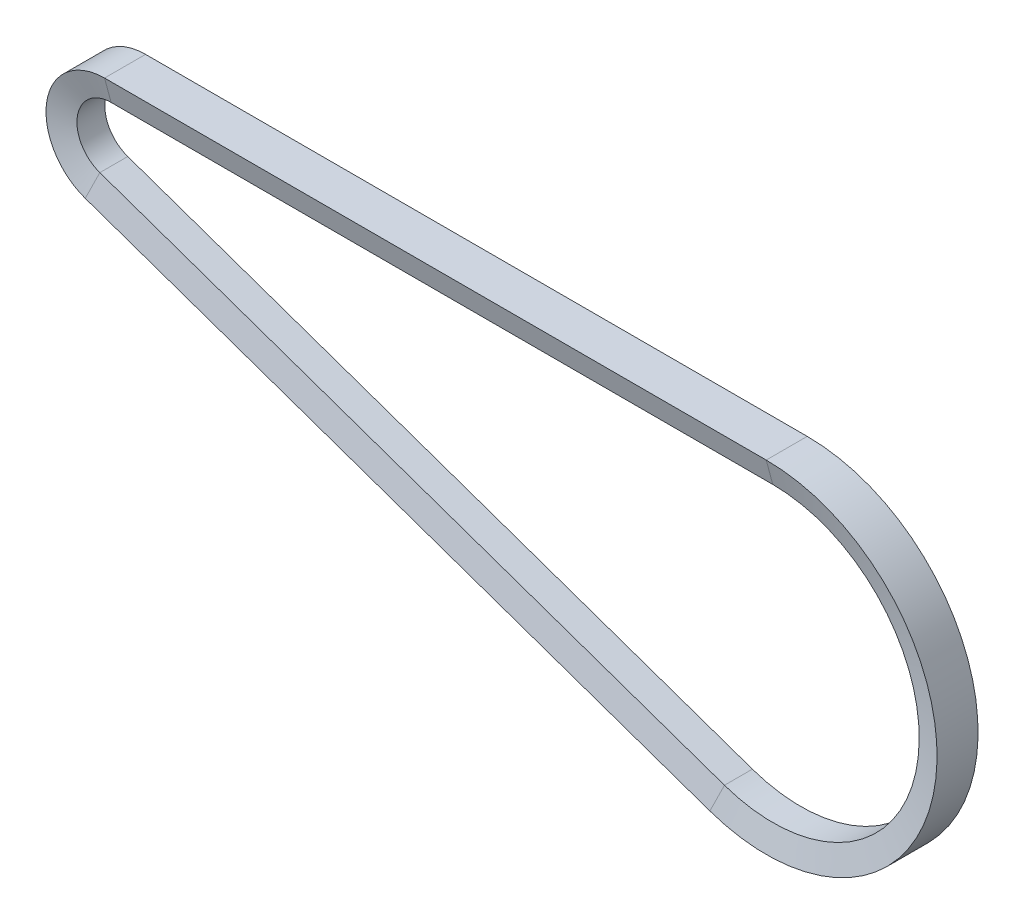
ISO-10303-21;
HEADER;
FILE_DESCRIPTION(('STEP AP214'),'2;1');
FILE_NAME('part.step','',(''),(''),'','','');
FILE_SCHEMA(('AUTOMOTIVE_DESIGN { 1 0 10303 214 1 1 1 1 }'));
ENDSEC;
DATA;
#1=APPLICATION_CONTEXT('core data for automotive mechanical design processes');
#2=APPLICATION_PROTOCOL_DEFINITION('international standard','automotive_design',2000,#1);
#3=PRODUCT_CONTEXT('',#1,'mechanical');
#4=PRODUCT('Part','Part','',(#3));
#5=PRODUCT_RELATED_PRODUCT_CATEGORY('part','',(#4));
#6=PRODUCT_DEFINITION_FORMATION('','',#4);
#7=PRODUCT_DEFINITION_CONTEXT('part definition',#1,'design');
#8=PRODUCT_DEFINITION('design','',#6,#7);
#9=PRODUCT_DEFINITION_SHAPE('','',#8);
#10=(LENGTH_UNIT() NAMED_UNIT(*) SI_UNIT(.MILLI.,.METRE.));
#11=(NAMED_UNIT(*) PLANE_ANGLE_UNIT() SI_UNIT($,.RADIAN.));
#12=(NAMED_UNIT(*) SI_UNIT($,.STERADIAN.) SOLID_ANGLE_UNIT());
#13=UNCERTAINTY_MEASURE_WITH_UNIT(LENGTH_MEASURE(1.E-05),#10,'distance_accuracy_value','');
#14=(GEOMETRIC_REPRESENTATION_CONTEXT(3) GLOBAL_UNCERTAINTY_ASSIGNED_CONTEXT((#13)) GLOBAL_UNIT_ASSIGNED_CONTEXT((#10,
#11,#12)) REPRESENTATION_CONTEXT('',''));
#15=CARTESIAN_POINT('',(0.,0.,0.));
#16=DIRECTION('',(0.,0.,1.));
#17=DIRECTION('',(1.,0.,0.));
#18=AXIS2_PLACEMENT_3D('',#15,#16,#17);
#19=CARTESIAN_POINT('',(0.,10.,-8.4));
#20=DIRECTION('',(0.,0.258819045102518,0.965925826289069));
#21=DIRECTION('',(0.,-0.965925826289069,0.258819045102518));
#22=AXIS2_PLACEMENT_3D('',#19,#20,#21);
#23=PLANE('',#22);
#24=DIRECTION('',(-1.,0.,0.));
#25=VECTOR('',#24,1.);
#26=CARTESIAN_POINT('',(0.,10.,-8.4));
#27=LINE('',#26,#25);
#28=CARTESIAN_POINT('',(138.062716113244,9.99999999999999,-8.4));
#29=VERTEX_POINT('',#28);
#30=CARTESIAN_POINT('',(-133.062716113244,10.,-8.4));
#31=VERTEX_POINT('',#30);
#32=EDGE_CURVE('E158',#29,#31,#27,.T.);
#33=ORIENTED_EDGE('',*,*,#32,.F.);
#34=DIRECTION('',(0.,0.965925826289069,-0.258819045102518));
#35=VECTOR('',#34,1.);
#36=CARTESIAN_POINT('',(138.062716113244,10.,-8.4));
#37=LINE('',#36,#35);
#38=CARTESIAN_POINT('',(138.062716113244,0.,-5.72050807568881));
#39=VERTEX_POINT('',#38);
#40=EDGE_CURVE('E161',#39,#29,#37,.T.);
#41=ORIENTED_EDGE('',*,*,#40,.F.);
#42=DIRECTION('',(-1.,0.,0.));
#43=VECTOR('',#42,1.);
#44=CARTESIAN_POINT('',(0.,0.,-5.72050807568881));
#45=LINE('',#44,#43);
#46=CARTESIAN_POINT('',(-133.062716113244,0.,-5.72050807568881));
#47=VERTEX_POINT('',#46);
#48=EDGE_CURVE('E149',#39,#47,#45,.T.);
#49=ORIENTED_EDGE('',*,*,#48,.T.);
#50=DIRECTION('',(0.,0.965925826289069,-0.258819045102518));
#51=VECTOR('',#50,1.);
#52=CARTESIAN_POINT('',(-133.062716113244,10.,-8.4));
#53=LINE('',#52,#51);
#54=EDGE_CURVE('E152',#47,#31,#53,.T.);
#55=ORIENTED_EDGE('',*,*,#54,.T.);
#56=EDGE_LOOP('',(#33,#41,#49,#55));
#57=FACE_BOUND('',#56,.T.);
#58=ADVANCED_FACE('F39',(#57),#23,.F.);
#59=CARTESIAN_POINT('',(0.,10.,8.4));
#60=DIRECTION('',(0.,-1.,0.));
#61=DIRECTION('',(0.,0.,-1.));
#62=AXIS2_PLACEMENT_3D('',#59,#60,#61);
#63=PLANE('',#62);
#64=DIRECTION('',(-1.,0.,0.));
#65=VECTOR('',#64,1.);
#66=CARTESIAN_POINT('',(0.,10.,8.4));
#67=LINE('',#66,#65);
#68=CARTESIAN_POINT('',(138.062716113244,9.99999999999999,8.4));
#69=VERTEX_POINT('',#68);
#70=CARTESIAN_POINT('',(-133.062716113244,10.,8.4));
#71=VERTEX_POINT('',#70);
#72=EDGE_CURVE('E63',#69,#71,#67,.T.);
#73=ORIENTED_EDGE('',*,*,#72,.F.);
#74=DIRECTION('',(0.,0.,1.));
#75=VECTOR('',#74,1.);
#76=CARTESIAN_POINT('',(138.062716113244,10.,8.4));
#77=LINE('',#76,#75);
#78=EDGE_CURVE('E179',#29,#69,#77,.T.);
#79=ORIENTED_EDGE('',*,*,#78,.F.);
#80=ORIENTED_EDGE('',*,*,#32,.T.);
#81=DIRECTION('',(0.,0.,1.));
#82=VECTOR('',#81,1.);
#83=CARTESIAN_POINT('',(-133.062716113244,10.,8.4));
#84=LINE('',#83,#82);
#85=EDGE_CURVE('E182',#31,#71,#84,.T.);
#86=ORIENTED_EDGE('',*,*,#85,.T.);
#87=EDGE_LOOP('',(#73,#79,#80,#86));
#88=FACE_BOUND('',#87,.T.);
#89=ADVANCED_FACE('F241',(#88),#63,.F.);
#90=CARTESIAN_POINT('',(0.,0.,5.72050807568881));
#91=DIRECTION('',(0.,0.258819045102518,-0.965925826289069));
#92=DIRECTION('',(0.,0.965925826289069,0.258819045102518));
#93=AXIS2_PLACEMENT_3D('',#90,#91,#92);
#94=PLANE('',#93);
#95=DIRECTION('',(-1.,0.,0.));
#96=VECTOR('',#95,1.);
#97=CARTESIAN_POINT('',(0.,0.,5.72050807568881));
#98=LINE('',#97,#96);
#99=CARTESIAN_POINT('',(138.062716113244,0.,5.72050807568881));
#100=VERTEX_POINT('',#99);
#101=CARTESIAN_POINT('',(-133.062716113244,0.,5.72050807568881));
#102=VERTEX_POINT('',#101);
#103=EDGE_CURVE('E54',#100,#102,#98,.T.);
#104=ORIENTED_EDGE('',*,*,#103,.F.);
#105=DIRECTION('',(0.,-0.965925826289069,-0.258819045102518));
#106=VECTOR('',#105,1.);
#107=CARTESIAN_POINT('',(138.062716113244,0.,5.72050807568881));
#108=LINE('',#107,#106);
#109=EDGE_CURVE('E197',#69,#100,#108,.T.);
#110=ORIENTED_EDGE('',*,*,#109,.F.);
#111=ORIENTED_EDGE('',*,*,#72,.T.);
#112=DIRECTION('',(0.,-0.965925826289069,-0.258819045102518));
#113=VECTOR('',#112,1.);
#114=CARTESIAN_POINT('',(-133.062716113244,0.,5.72050807568881));
#115=LINE('',#114,#113);
#116=EDGE_CURVE('E185',#71,#102,#115,.T.);
#117=ORIENTED_EDGE('',*,*,#116,.T.);
#118=EDGE_LOOP('',(#104,#110,#111,#117));
#119=FACE_BOUND('',#118,.T.);
#120=ADVANCED_FACE('F238',(#119),#94,.F.);
#121=CARTESIAN_POINT('',(0.,0.,-5.72050807568881));
#122=DIRECTION('',(0.,1.,0.));
#123=DIRECTION('',(0.,0.,1.));
#124=AXIS2_PLACEMENT_3D('',#121,#122,#123);
#125=PLANE('',#124);
#126=DIRECTION('',(0.,0.,-1.));
#127=VECTOR('',#126,1.);
#128=CARTESIAN_POINT('',(-133.062716113244,0.,-5.72050807568881));
#129=LINE('',#128,#127);
#130=EDGE_CURVE('E138',#102,#47,#129,.T.);
#131=ORIENTED_EDGE('',*,*,#130,.T.);
#132=ORIENTED_EDGE('',*,*,#48,.F.);
#133=DIRECTION('',(0.,0.,-1.));
#134=VECTOR('',#133,1.);
#135=CARTESIAN_POINT('',(138.062716113244,0.,-5.72050807568881));
#136=LINE('',#135,#134);
#137=EDGE_CURVE('E11',#100,#39,#136,.T.);
#138=ORIENTED_EDGE('',*,*,#137,.F.);
#139=ORIENTED_EDGE('',*,*,#103,.T.);
#140=EDGE_LOOP('',(#131,#132,#138,#139));
#141=FACE_BOUND('',#140,.T.);
#142=ADVANCED_FACE('F147',(#141),#125,.F.);
#143=CARTESIAN_POINT('',(-133.062716113244,-14.,-5.72050807568881));
#144=DIRECTION('',(0.,0.,-1.));
#145=DIRECTION('',(-1.,0.,0.));
#146=AXIS2_PLACEMENT_3D('',#143,#144,#145);
#147=CONICAL_SURFACE('',#146,14.,1.30899693899575);
#148=CARTESIAN_POINT('',(-133.062716113244,-14.,-8.4));
#149=DIRECTION('',(0.,0.,1.));
#150=DIRECTION('',(0.,1.,0.));
#151=AXIS2_PLACEMENT_3D('',#148,#149,#150);
#152=CIRCLE('',#151,24.);
#153=CARTESIAN_POINT('',(-140.978682451837,-36.6569520661157,-8.4));
#154=VERTEX_POINT('',#153);
#155=EDGE_CURVE('E155',#31,#154,#152,.T.);
#156=ORIENTED_EDGE('',*,*,#155,.F.);
#157=ORIENTED_EDGE('',*,*,#54,.F.);
#158=CARTESIAN_POINT('',(-133.062716113244,-14.,-5.72050807568881));
#159=DIRECTION('',(0.,0.,1.));
#160=DIRECTION('',(0.,1.,0.));
#161=AXIS2_PLACEMENT_3D('',#158,#159,#160);
#162=CIRCLE('',#161,14.);
#163=CARTESIAN_POINT('',(-137.68036314409,-27.2165553719008,-5.72050807568881));
#164=VERTEX_POINT('',#163);
#165=EDGE_CURVE('E134',#47,#164,#162,.T.);
#166=ORIENTED_EDGE('',*,*,#165,.T.);
#167=DIRECTION('',(-0.318593180270075,-0.91187229773561,-0.258819045102518));
#168=VECTOR('',#167,1.);
#169=CARTESIAN_POINT('',(-140.978682451837,-36.6569520661157,-8.4));
#170=LINE('',#169,#168);
#171=EDGE_CURVE('E144',#164,#154,#170,.T.);
#172=ORIENTED_EDGE('',*,*,#171,.T.);
#173=EDGE_LOOP('',(#156,#157,#166,#172));
#174=FACE_BOUND('',#173,.T.);
#175=ADVANCED_FACE('F153',(#174),#147,.F.);
#176=CARTESIAN_POINT('',(-133.062716113244,-14.,0.));
#177=DIRECTION('',(0.,0.,1.));
#178=DIRECTION('',(1.,0.,0.));
#179=AXIS2_PLACEMENT_3D('',#176,#177,#178);
#180=CYLINDRICAL_SURFACE('',#179,24.);
#181=CARTESIAN_POINT('',(-133.062716113244,-14.,8.4));
#182=DIRECTION('',(0.,0.,1.));
#183=DIRECTION('',(0.,1.,0.));
#184=AXIS2_PLACEMENT_3D('',#181,#182,#183);
#185=CIRCLE('',#184,24.);
#186=CARTESIAN_POINT('',(-140.978682451837,-36.6569520661157,8.4));
#187=VERTEX_POINT('',#186);
#188=EDGE_CURVE('E188',#71,#187,#185,.T.);
#189=ORIENTED_EDGE('',*,*,#188,.F.);
#190=ORIENTED_EDGE('',*,*,#85,.F.);
#191=ORIENTED_EDGE('',*,*,#155,.T.);
#192=DIRECTION('',(0.,0.,1.));
#193=VECTOR('',#192,1.);
#194=CARTESIAN_POINT('',(-140.978682451837,-36.6569520661157,8.4));
#195=LINE('',#194,#193);
#196=EDGE_CURVE('E167',#154,#187,#195,.T.);
#197=ORIENTED_EDGE('',*,*,#196,.T.);
#198=EDGE_LOOP('',(#189,#190,#191,#197));
#199=FACE_BOUND('',#198,.T.);
#200=ADVANCED_FACE('F243',(#199),#180,.T.);
#201=CARTESIAN_POINT('',(-133.062716113244,-14.,8.4));
#202=DIRECTION('',(0.,0.,1.));
#203=DIRECTION('',(1.,0.,0.));
#204=AXIS2_PLACEMENT_3D('',#201,#202,#203);
#205=CONICAL_SURFACE('',#204,24.,1.30899693899575);
#206=CARTESIAN_POINT('',(-133.062716113244,-14.,5.72050807568881));
#207=DIRECTION('',(0.,0.,1.));
#208=DIRECTION('',(0.,1.,0.));
#209=AXIS2_PLACEMENT_3D('',#206,#207,#208);
#210=CIRCLE('',#209,14.);
#211=CARTESIAN_POINT('',(-137.68036314409,-27.2165553719008,5.72050807568881));
#212=VERTEX_POINT('',#211);
#213=EDGE_CURVE('E202',#102,#212,#210,.T.);
#214=ORIENTED_EDGE('',*,*,#213,.F.);
#215=ORIENTED_EDGE('',*,*,#116,.F.);
#216=ORIENTED_EDGE('',*,*,#188,.T.);
#217=DIRECTION('',(0.318593180270075,0.911872297735609,-0.258819045102518));
#218=VECTOR('',#217,1.);
#219=CARTESIAN_POINT('',(-137.68036314409,-27.2165553719008,5.72050807568881));
#220=LINE('',#219,#218);
#221=EDGE_CURVE('E191',#187,#212,#220,.T.);
#222=ORIENTED_EDGE('',*,*,#221,.T.);
#223=EDGE_LOOP('',(#214,#215,#216,#222));
#224=FACE_BOUND('',#223,.T.);
#225=ADVANCED_FACE('F226',(#224),#205,.F.);
#226=CARTESIAN_POINT('',(-133.062716113244,-14.,0.));
#227=DIRECTION('',(0.,0.,1.));
#228=DIRECTION('',(1.,0.,0.));
#229=AXIS2_PLACEMENT_3D('',#226,#227,#228);
#230=CYLINDRICAL_SURFACE('',#229,14.);
#231=DIRECTION('',(0.,0.,-1.));
#232=VECTOR('',#231,1.);
#233=CARTESIAN_POINT('',(-137.68036314409,-27.2165553719008,-5.72050807568881));
#234=LINE('',#233,#232);
#235=EDGE_CURVE('E140',#212,#164,#234,.T.);
#236=ORIENTED_EDGE('',*,*,#235,.T.);
#237=ORIENTED_EDGE('',*,*,#165,.F.);
#238=ORIENTED_EDGE('',*,*,#130,.F.);
#239=ORIENTED_EDGE('',*,*,#213,.T.);
#240=EDGE_LOOP('',(#236,#237,#238,#239));
#241=FACE_BOUND('',#240,.T.);
#242=ADVANCED_FACE('F136',(#241),#230,.F.);
#243=CARTESIAN_POINT('',(-140.978682451837,-36.6569520661157,-8.4));
#244=DIRECTION('',(-0.0853667853674282,-0.244335445778566,0.965925826289069));
#245=DIRECTION('',(0.,-0.969464767025028,-0.24523063735412));
#246=AXIS2_PLACEMENT_3D('',#243,#244,#245);
#247=PLANE('',#246);
#248=DIRECTION('',(0.944039669421488,-0.329831930774703,0.));
#249=VECTOR('',#248,1.);
#250=CARTESIAN_POINT('',(-140.978682451837,-36.6569520661157,-8.4));
#251=LINE('',#250,#249);
#252=CARTESIAN_POINT('',(114.974480959015,-126.082776859504,-8.4));
#253=VERTEX_POINT('',#252);
#254=EDGE_CURVE('E122',#154,#253,#251,.T.);
#255=ORIENTED_EDGE('',*,*,#254,.F.);
#256=ORIENTED_EDGE('',*,*,#171,.F.);
#257=DIRECTION('',(0.944039669421488,-0.329831930774703,0.));
#258=VECTOR('',#257,1.);
#259=CARTESIAN_POINT('',(-137.68036314409,-27.2165553719008,-5.72050807568881));
#260=LINE('',#259,#258);
#261=CARTESIAN_POINT('',(118.272800266762,-116.642380165289,-5.72050807568881));
#262=VERTEX_POINT('',#261);
#263=EDGE_CURVE('E171',#164,#262,#260,.T.);
#264=ORIENTED_EDGE('',*,*,#263,.T.);
#265=DIRECTION('',(-0.318593180270074,-0.91187229773561,-0.258819045102518));
#266=VECTOR('',#265,1.);
#267=CARTESIAN_POINT('',(114.974480959015,-126.082776859504,-8.4));
#268=LINE('',#267,#266);
#269=EDGE_CURVE('E169',#262,#253,#268,.T.);
#270=ORIENTED_EDGE('',*,*,#269,.T.);
#271=EDGE_LOOP('',(#255,#256,#264,#270));
#272=FACE_BOUND('',#271,.T.);
#273=ADVANCED_FACE('F216',(#272),#247,.F.);
#274=CARTESIAN_POINT('',(-140.978682451837,-36.6569520661157,8.4));
#275=DIRECTION('',(0.329831930774703,0.944039669421488,0.));
#276=DIRECTION('',(-0.944039669421488,0.329831930774703,0.));
#277=AXIS2_PLACEMENT_3D('',#274,#275,#276);
#278=PLANE('',#277);
#279=DIRECTION('',(0.944039669421488,-0.329831930774703,0.));
#280=VECTOR('',#279,1.);
#281=CARTESIAN_POINT('',(-140.978682451837,-36.6569520661157,8.4));
#282=LINE('',#281,#280);
#283=CARTESIAN_POINT('',(114.974480959015,-126.082776859504,8.4));
#284=VERTEX_POINT('',#283);
#285=EDGE_CURVE('E115',#187,#284,#282,.T.);
#286=ORIENTED_EDGE('',*,*,#285,.F.);
#287=ORIENTED_EDGE('',*,*,#196,.F.);
#288=ORIENTED_EDGE('',*,*,#254,.T.);
#289=DIRECTION('',(0.,0.,1.));
#290=VECTOR('',#289,1.);
#291=CARTESIAN_POINT('',(114.974480959015,-126.082776859504,8.4));
#292=LINE('',#291,#290);
#293=EDGE_CURVE('E173',#253,#284,#292,.T.);
#294=ORIENTED_EDGE('',*,*,#293,.T.);
#295=EDGE_LOOP('',(#286,#287,#288,#294));
#296=FACE_BOUND('',#295,.T.);
#297=ADVANCED_FACE('F218',(#296),#278,.F.);
#298=CARTESIAN_POINT('',(-137.68036314409,-27.2165553719008,5.72050807568881));
#299=DIRECTION('',(-0.0853667853674285,-0.244335445778566,-0.965925826289069));
#300=DIRECTION('',(0.,0.969464767025028,-0.245230637354121));
#301=AXIS2_PLACEMENT_3D('',#298,#299,#300);
#302=PLANE('',#301);
#303=DIRECTION('',(0.944039669421488,-0.329831930774703,0.));
#304=VECTOR('',#303,1.);
#305=CARTESIAN_POINT('',(-137.68036314409,-27.2165553719008,5.72050807568881));
#306=LINE('',#305,#304);
#307=CARTESIAN_POINT('',(118.272800266762,-116.642380165289,5.72050807568881));
#308=VERTEX_POINT('',#307);
#309=EDGE_CURVE('E206',#212,#308,#306,.T.);
#310=ORIENTED_EDGE('',*,*,#309,.F.);
#311=ORIENTED_EDGE('',*,*,#221,.F.);
#312=ORIENTED_EDGE('',*,*,#285,.T.);
#313=DIRECTION('',(0.318593180270074,0.91187229773561,-0.258819045102518));
#314=VECTOR('',#313,1.);
#315=CARTESIAN_POINT('',(118.272800266762,-116.642380165289,5.72050807568881));
#316=LINE('',#315,#314);
#317=EDGE_CURVE('E194',#284,#308,#316,.T.);
#318=ORIENTED_EDGE('',*,*,#317,.T.);
#319=EDGE_LOOP('',(#310,#311,#312,#318));
#320=FACE_BOUND('',#319,.T.);
#321=ADVANCED_FACE('F224',(#320),#302,.F.);
#322=CARTESIAN_POINT('',(-137.68036314409,-27.2165553719008,-5.72050807568881));
#323=DIRECTION('',(-0.329831930774703,-0.944039669421488,0.));
#324=DIRECTION('',(0.944039669421488,-0.329831930774703,0.));
#325=AXIS2_PLACEMENT_3D('',#322,#323,#324);
#326=PLANE('',#325);
#327=DIRECTION('',(0.,0.,-1.));
#328=VECTOR('',#327,1.);
#329=CARTESIAN_POINT('',(118.272800266762,-116.642380165289,-5.72050807568881));
#330=LINE('',#329,#328);
#331=EDGE_CURVE('E181',#308,#262,#330,.T.);
#332=ORIENTED_EDGE('',*,*,#331,.T.);
#333=ORIENTED_EDGE('',*,*,#263,.F.);
#334=ORIENTED_EDGE('',*,*,#235,.F.);
#335=ORIENTED_EDGE('',*,*,#309,.T.);
#336=EDGE_LOOP('',(#332,#333,#334,#335));
#337=FACE_BOUND('',#336,.T.);
#338=ADVANCED_FACE('F213',(#337),#326,.F.);
#339=CARTESIAN_POINT('',(138.062716113244,-60.,-5.72050807568881));
#340=DIRECTION('',(0.,0.,-1.));
#341=DIRECTION('',(-1.,0.,0.));
#342=AXIS2_PLACEMENT_3D('',#339,#340,#341);
#343=CONICAL_SURFACE('',#342,60.,1.30899693899575);
#344=CARTESIAN_POINT('',(138.062716113244,-60.,-8.4));
#345=DIRECTION('',(0.,0.,1.));
#346=DIRECTION('',(-0.329831930774703,-0.944039669421488,0.));
#347=AXIS2_PLACEMENT_3D('',#344,#345,#346);
#348=CIRCLE('',#347,70.);
#349=EDGE_CURVE('E102',#253,#29,#348,.T.);
#350=ORIENTED_EDGE('',*,*,#349,.F.);
#351=ORIENTED_EDGE('',*,*,#269,.F.);
#352=CARTESIAN_POINT('',(138.062716113244,-60.,-5.72050807568881));
#353=DIRECTION('',(0.,0.,1.));
#354=DIRECTION('',(-0.329831930774703,-0.944039669421488,0.));
#355=AXIS2_PLACEMENT_3D('',#352,#353,#354);
#356=CIRCLE('',#355,60.);
#357=EDGE_CURVE('E177',#262,#39,#356,.T.);
#358=ORIENTED_EDGE('',*,*,#357,.T.);
#359=ORIENTED_EDGE('',*,*,#40,.T.);
#360=EDGE_LOOP('',(#350,#351,#358,#359));
#361=FACE_BOUND('',#360,.T.);
#362=ADVANCED_FACE('F215',(#361),#343,.F.);
#363=CARTESIAN_POINT('',(138.062716113244,-60.,0.));
#364=DIRECTION('',(0.,0.,1.));
#365=DIRECTION('',(1.,0.,0.));
#366=AXIS2_PLACEMENT_3D('',#363,#364,#365);
#367=CYLINDRICAL_SURFACE('',#366,70.);
#368=CARTESIAN_POINT('',(138.062716113244,-60.,8.4));
#369=DIRECTION('',(0.,0.,1.));
#370=DIRECTION('',(-0.329831930774703,-0.944039669421488,0.));
#371=AXIS2_PLACEMENT_3D('',#368,#369,#370);
#372=CIRCLE('',#371,70.);
#373=EDGE_CURVE('E95',#284,#69,#372,.T.);
#374=ORIENTED_EDGE('',*,*,#373,.F.);
#375=ORIENTED_EDGE('',*,*,#293,.F.);
#376=ORIENTED_EDGE('',*,*,#349,.T.);
#377=ORIENTED_EDGE('',*,*,#78,.T.);
#378=EDGE_LOOP('',(#374,#375,#376,#377));
#379=FACE_BOUND('',#378,.T.);
#380=ADVANCED_FACE('F236',(#379),#367,.T.);
#381=CARTESIAN_POINT('',(138.062716113244,-60.,8.4));
#382=DIRECTION('',(0.,0.,1.));
#383=DIRECTION('',(1.,0.,0.));
#384=AXIS2_PLACEMENT_3D('',#381,#382,#383);
#385=CONICAL_SURFACE('',#384,70.,1.30899693899575);
#386=CARTESIAN_POINT('',(138.062716113244,-60.,5.72050807568881));
#387=DIRECTION('',(0.,0.,1.));
#388=DIRECTION('',(-0.329831930774703,-0.944039669421488,0.));
#389=AXIS2_PLACEMENT_3D('',#386,#387,#388);
#390=CIRCLE('',#389,60.);
#391=EDGE_CURVE('E47',#308,#100,#390,.T.);
#392=ORIENTED_EDGE('',*,*,#391,.F.);
#393=ORIENTED_EDGE('',*,*,#317,.F.);
#394=ORIENTED_EDGE('',*,*,#373,.T.);
#395=ORIENTED_EDGE('',*,*,#109,.T.);
#396=EDGE_LOOP('',(#392,#393,#394,#395));
#397=FACE_BOUND('',#396,.T.);
#398=ADVANCED_FACE('F231',(#397),#385,.F.);
#399=CARTESIAN_POINT('',(138.062716113244,-60.,0.));
#400=DIRECTION('',(0.,0.,1.));
#401=DIRECTION('',(1.,0.,0.));
#402=AXIS2_PLACEMENT_3D('',#399,#400,#401);
#403=CYLINDRICAL_SURFACE('',#402,60.);
#404=ORIENTED_EDGE('',*,*,#137,.T.);
#405=ORIENTED_EDGE('',*,*,#357,.F.);
#406=ORIENTED_EDGE('',*,*,#331,.F.);
#407=ORIENTED_EDGE('',*,*,#391,.T.);
#408=EDGE_LOOP('',(#404,#405,#406,#407));
#409=FACE_BOUND('',#408,.T.);
#410=ADVANCED_FACE('F41',(#409),#403,.F.);
#411=CLOSED_SHELL('',(#58,#89,#120,#142,#175,#200,#225,#242,#273,#297,#321,#338,#362,#380,#398,#410));
#412=MANIFOLD_SOLID_BREP('B2',#411);
#413=ADVANCED_BREP_SHAPE_REPRESENTATION('',(#18,#412),#14);
#414=SHAPE_DEFINITION_REPRESENTATION(#9,#413);
ENDSEC;
END-ISO-10303-21;
